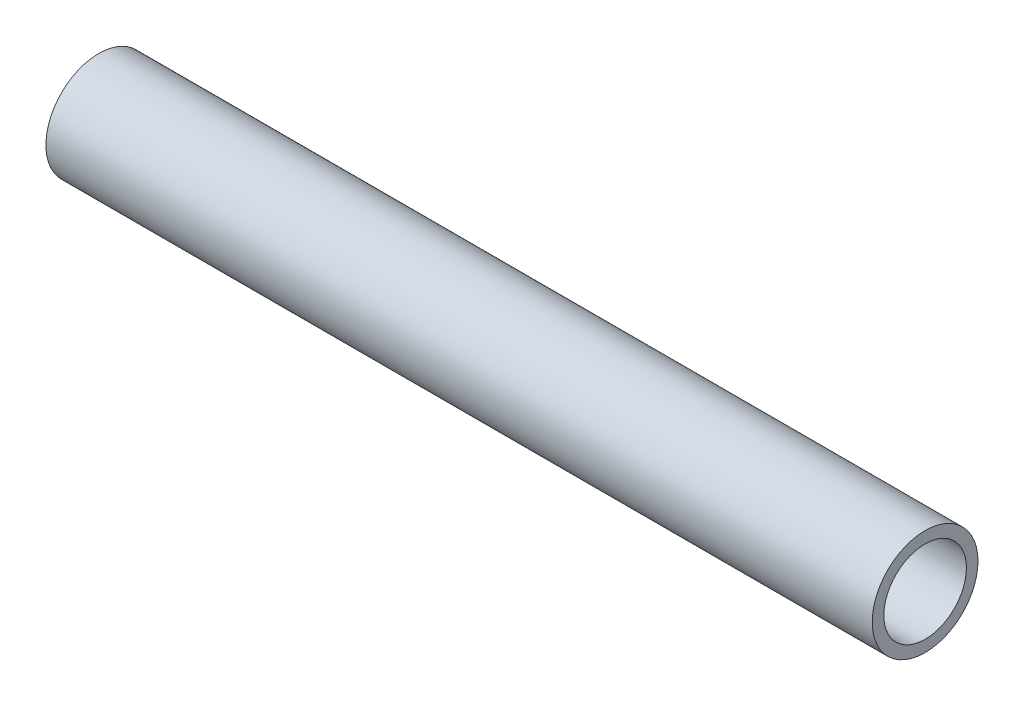
ISO-10303-21;
HEADER;
FILE_DESCRIPTION(('STEP AP214'),'2;1');
FILE_NAME('part.step','',(''),(''),'','','');
FILE_SCHEMA(('AUTOMOTIVE_DESIGN { 1 0 10303 214 1 1 1 1 }'));
ENDSEC;
DATA;
#1=APPLICATION_CONTEXT('core data for automotive mechanical design processes');
#2=APPLICATION_PROTOCOL_DEFINITION('international standard','automotive_design',2000,#1);
#3=PRODUCT_CONTEXT('',#1,'mechanical');
#4=PRODUCT('Part','Part','',(#3));
#5=PRODUCT_RELATED_PRODUCT_CATEGORY('part','',(#4));
#6=PRODUCT_DEFINITION_FORMATION('','',#4);
#7=PRODUCT_DEFINITION_CONTEXT('part definition',#1,'design');
#8=PRODUCT_DEFINITION('design','',#6,#7);
#9=PRODUCT_DEFINITION_SHAPE('','',#8);
#10=(LENGTH_UNIT() NAMED_UNIT(*) SI_UNIT(.MILLI.,.METRE.));
#11=(NAMED_UNIT(*) PLANE_ANGLE_UNIT() SI_UNIT($,.RADIAN.));
#12=(NAMED_UNIT(*) SI_UNIT($,.STERADIAN.) SOLID_ANGLE_UNIT());
#13=UNCERTAINTY_MEASURE_WITH_UNIT(LENGTH_MEASURE(1.E-05),#10,'distance_accuracy_value','');
#14=(GEOMETRIC_REPRESENTATION_CONTEXT(3) GLOBAL_UNCERTAINTY_ASSIGNED_CONTEXT((#13)) GLOBAL_UNIT_ASSIGNED_CONTEXT((#10,
#11,#12)) REPRESENTATION_CONTEXT('',''));
#15=CARTESIAN_POINT('',(0.,0.,0.));
#16=DIRECTION('',(0.,0.,1.));
#17=DIRECTION('',(1.,0.,0.));
#18=AXIS2_PLACEMENT_3D('',#15,#16,#17);
#19=CARTESIAN_POINT('',(63.5,0.,0.));
#20=DIRECTION('',(1.,0.,0.));
#21=DIRECTION('',(0.,0.,-1.));
#22=AXIS2_PLACEMENT_3D('',#19,#20,#21);
#23=PLANE('',#22);
#24=CARTESIAN_POINT('',(63.5,0.,0.));
#25=DIRECTION('',(1.,0.,0.));
#26=DIRECTION('',(0.,0.,-1.));
#27=AXIS2_PLACEMENT_3D('',#24,#25,#26);
#28=CIRCLE('',#27,4.064);
#29=CARTESIAN_POINT('',(63.5,0.,-4.064));
#30=VERTEX_POINT('',#29);
#31=EDGE_CURVE('E10',#30,#30,#28,.T.);
#32=ORIENTED_EDGE('',*,*,#31,.T.);
#33=EDGE_LOOP('',(#32));
#34=FACE_BOUND('',#33,.T.);
#35=CARTESIAN_POINT('',(63.5,0.,0.));
#36=DIRECTION('',(1.,0.,0.));
#37=DIRECTION('',(0.,0.,-1.));
#38=AXIS2_PLACEMENT_3D('',#35,#36,#37);
#39=CIRCLE('',#38,3.175);
#40=CARTESIAN_POINT('',(63.5,0.,-3.175));
#41=VERTEX_POINT('',#40);
#42=EDGE_CURVE('E42',#41,#41,#39,.T.);
#43=ORIENTED_EDGE('',*,*,#42,.F.);
#44=EDGE_LOOP('',(#43));
#45=FACE_BOUND('',#44,.T.);
#46=ADVANCED_FACE('F31',(#34,#45),#23,.T.);
#47=CARTESIAN_POINT('',(0.,0.,0.));
#48=DIRECTION('',(1.,0.,0.));
#49=DIRECTION('',(0.,0.,-1.));
#50=AXIS2_PLACEMENT_3D('',#47,#48,#49);
#51=PLANE('',#50);
#52=CARTESIAN_POINT('',(0.,0.,0.));
#53=DIRECTION('',(1.,0.,0.));
#54=DIRECTION('',(0.,0.,-1.));
#55=AXIS2_PLACEMENT_3D('',#52,#53,#54);
#56=CIRCLE('',#55,4.064);
#57=CARTESIAN_POINT('',(0.,0.,-4.064));
#58=VERTEX_POINT('',#57);
#59=EDGE_CURVE('E35',#58,#58,#56,.T.);
#60=ORIENTED_EDGE('',*,*,#59,.F.);
#61=EDGE_LOOP('',(#60));
#62=FACE_BOUND('',#61,.T.);
#63=CARTESIAN_POINT('',(0.,0.,0.));
#64=DIRECTION('',(1.,0.,0.));
#65=DIRECTION('',(0.,0.,-1.));
#66=AXIS2_PLACEMENT_3D('',#63,#64,#65);
#67=CIRCLE('',#66,3.175);
#68=CARTESIAN_POINT('',(0.,0.,-3.175));
#69=VERTEX_POINT('',#68);
#70=EDGE_CURVE('E44',#69,#69,#67,.T.);
#71=ORIENTED_EDGE('',*,*,#70,.T.);
#72=EDGE_LOOP('',(#71));
#73=FACE_BOUND('',#72,.T.);
#74=ADVANCED_FACE('F54',(#62,#73),#51,.F.);
#75=CARTESIAN_POINT('',(63.5,0.,0.));
#76=DIRECTION('',(-1.,0.,0.));
#77=DIRECTION('',(0.,0.,1.));
#78=AXIS2_PLACEMENT_3D('',#75,#76,#77);
#79=CYLINDRICAL_SURFACE('',#78,4.064);
#80=ORIENTED_EDGE('',*,*,#31,.F.);
#81=EDGE_LOOP('',(#80));
#82=FACE_BOUND('',#81,.T.);
#83=ORIENTED_EDGE('',*,*,#59,.T.);
#84=EDGE_LOOP('',(#83));
#85=FACE_BOUND('',#84,.T.);
#86=ADVANCED_FACE('F33',(#82,#85),#79,.T.);
#87=CARTESIAN_POINT('',(63.5,0.,0.));
#88=DIRECTION('',(-1.,0.,0.));
#89=DIRECTION('',(0.,0.,1.));
#90=AXIS2_PLACEMENT_3D('',#87,#88,#89);
#91=CYLINDRICAL_SURFACE('',#90,3.175);
#92=ORIENTED_EDGE('',*,*,#42,.T.);
#93=EDGE_LOOP('',(#92));
#94=FACE_BOUND('',#93,.T.);
#95=ORIENTED_EDGE('',*,*,#70,.F.);
#96=EDGE_LOOP('',(#95));
#97=FACE_BOUND('',#96,.T.);
#98=ADVANCED_FACE('F50',(#94,#97),#91,.F.);
#99=CLOSED_SHELL('',(#46,#74,#86,#98));
#100=MANIFOLD_SOLID_BREP('B2',#99);
#101=ADVANCED_BREP_SHAPE_REPRESENTATION('',(#18,#100),#14);
#102=SHAPE_DEFINITION_REPRESENTATION(#9,#101);
ENDSEC;
END-ISO-10303-21;
